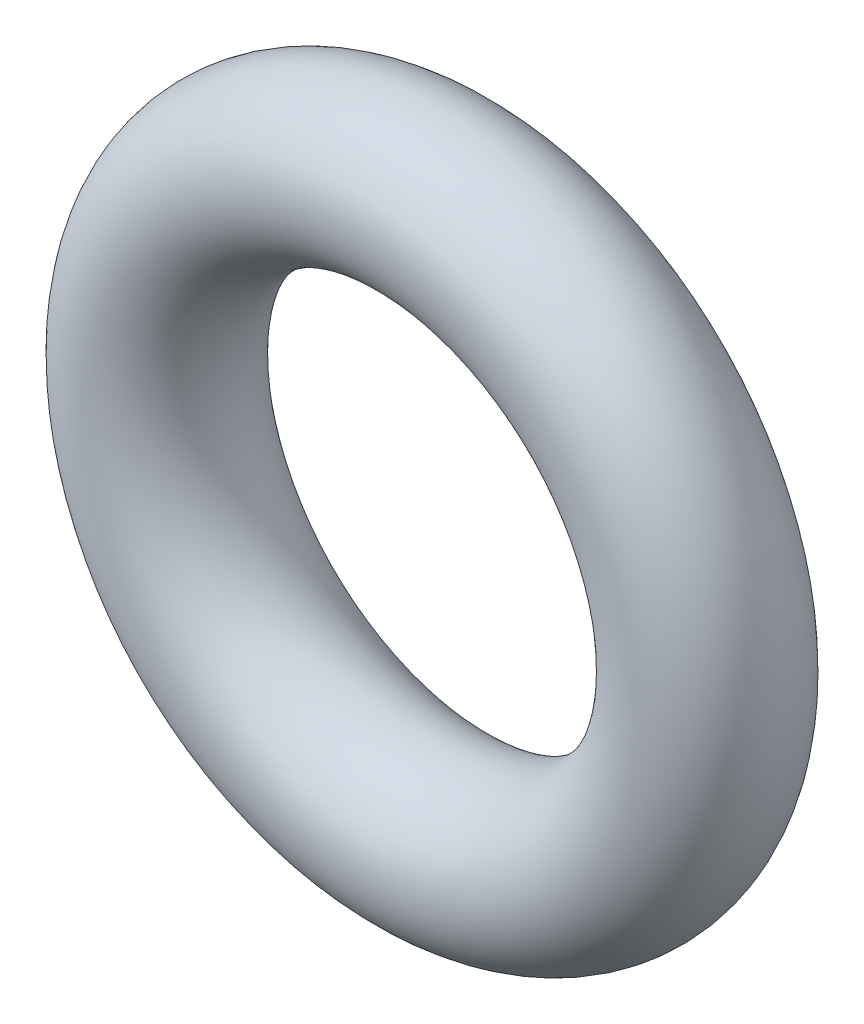
ISO-10303-21;
HEADER;
FILE_DESCRIPTION(('STEP AP214'),'2;1');
FILE_NAME('part.step','',(''),(''),'','','');
FILE_SCHEMA(('AUTOMOTIVE_DESIGN { 1 0 10303 214 1 1 1 1 }'));
ENDSEC;
DATA;
#1=APPLICATION_CONTEXT('core data for automotive mechanical design processes');
#2=APPLICATION_PROTOCOL_DEFINITION('international standard','automotive_design',2000,#1);
#3=PRODUCT_CONTEXT('',#1,'mechanical');
#4=PRODUCT('Part','Part','',(#3));
#5=PRODUCT_RELATED_PRODUCT_CATEGORY('part','',(#4));
#6=PRODUCT_DEFINITION_FORMATION('','',#4);
#7=PRODUCT_DEFINITION_CONTEXT('part definition',#1,'design');
#8=PRODUCT_DEFINITION('design','',#6,#7);
#9=PRODUCT_DEFINITION_SHAPE('','',#8);
#10=(LENGTH_UNIT() NAMED_UNIT(*) SI_UNIT(.MILLI.,.METRE.));
#11=(NAMED_UNIT(*) PLANE_ANGLE_UNIT() SI_UNIT($,.RADIAN.));
#12=(NAMED_UNIT(*) SI_UNIT($,.STERADIAN.) SOLID_ANGLE_UNIT());
#13=UNCERTAINTY_MEASURE_WITH_UNIT(LENGTH_MEASURE(1.E-05),#10,'distance_accuracy_value','');
#14=(GEOMETRIC_REPRESENTATION_CONTEXT(3) GLOBAL_UNCERTAINTY_ASSIGNED_CONTEXT((#13)) GLOBAL_UNIT_ASSIGNED_CONTEXT((#10,
#11,#12)) REPRESENTATION_CONTEXT('',''));
#15=CARTESIAN_POINT('',(0.,0.,0.));
#16=DIRECTION('',(0.,0.,1.));
#17=DIRECTION('',(1.,0.,0.));
#18=AXIS2_PLACEMENT_3D('',#15,#16,#17);
#19=CARTESIAN_POINT('',(0.,0.,0.));
#20=DIRECTION('',(0.,0.,1.));
#21=DIRECTION('',(1.,0.,0.));
#22=AXIS2_PLACEMENT_3D('',#19,#20,#21);
#23=TOROIDAL_SURFACE('',#22,3.125,0.89);
#24=CARTESIAN_POINT('',(4.015,0.,0.));
#25=VERTEX_POINT('',#24);
#26=VERTEX_LOOP('',#25);
#27=FACE_BOUND('',#26,.T.);
#28=ADVANCED_FACE('F30',(#27),#23,.T.);
#29=CLOSED_SHELL('',(#28));
#30=MANIFOLD_SOLID_BREP('B2',#29);
#31=ADVANCED_BREP_SHAPE_REPRESENTATION('',(#18,#30),#14);
#32=SHAPE_DEFINITION_REPRESENTATION(#9,#31);
ENDSEC;
END-ISO-10303-21;
